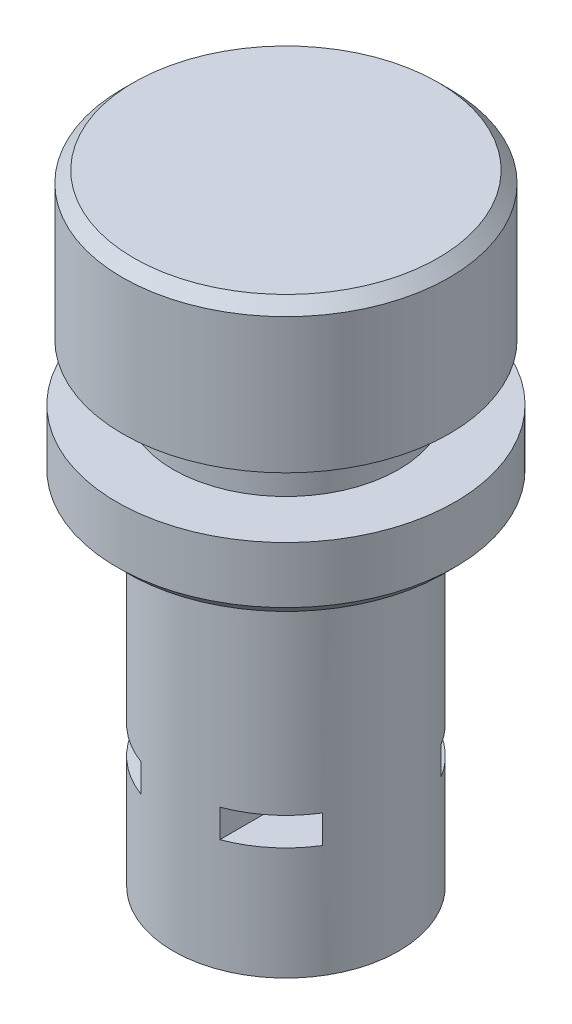
ISO-10303-21;
HEADER;
FILE_DESCRIPTION(('STEP AP214'),'2;1');
FILE_NAME('part.step','',(''),(''),'','','');
FILE_SCHEMA(('AUTOMOTIVE_DESIGN { 1 0 10303 214 1 1 1 1 }'));
ENDSEC;
DATA;
#1=APPLICATION_CONTEXT('core data for automotive mechanical design processes');
#2=APPLICATION_PROTOCOL_DEFINITION('international standard','automotive_design',2000,#1);
#3=PRODUCT_CONTEXT('',#1,'mechanical');
#4=PRODUCT('Part','Part','',(#3));
#5=PRODUCT_RELATED_PRODUCT_CATEGORY('part','',(#4));
#6=PRODUCT_DEFINITION_FORMATION('','',#4);
#7=PRODUCT_DEFINITION_CONTEXT('part definition',#1,'design');
#8=PRODUCT_DEFINITION('design','',#6,#7);
#9=PRODUCT_DEFINITION_SHAPE('','',#8);
#10=(LENGTH_UNIT() NAMED_UNIT(*) SI_UNIT(.MILLI.,.METRE.));
#11=(NAMED_UNIT(*) PLANE_ANGLE_UNIT() SI_UNIT($,.RADIAN.));
#12=(NAMED_UNIT(*) SI_UNIT($,.STERADIAN.) SOLID_ANGLE_UNIT());
#13=UNCERTAINTY_MEASURE_WITH_UNIT(LENGTH_MEASURE(1.E-05),#10,'distance_accuracy_value','');
#14=(GEOMETRIC_REPRESENTATION_CONTEXT(3) GLOBAL_UNCERTAINTY_ASSIGNED_CONTEXT((#13)) GLOBAL_UNIT_ASSIGNED_CONTEXT((#10,
#11,#12)) REPRESENTATION_CONTEXT('',''));
#15=CARTESIAN_POINT('',(0.,0.,0.));
#16=DIRECTION('',(0.,0.,1.));
#17=DIRECTION('',(1.,0.,0.));
#18=AXIS2_PLACEMENT_3D('',#15,#16,#17);
#19=CARTESIAN_POINT('',(0.,-42.,0.));
#20=DIRECTION('',(0.,1.,0.));
#21=DIRECTION('',(0.,0.,1.));
#22=AXIS2_PLACEMENT_3D('',#19,#20,#21);
#23=CYLINDRICAL_SURFACE('',#22,10.);
#24=CARTESIAN_POINT('',(0.,0.,0.));
#25=DIRECTION('',(0.,-1.,0.));
#26=DIRECTION('',(0.,0.,-1.));
#27=AXIS2_PLACEMENT_3D('',#24,#25,#26);
#28=CIRCLE('',#27,10.);
#29=CARTESIAN_POINT('',(0.,0.,10.));
#30=VERTEX_POINT('',#29);
#31=EDGE_CURVE('E242',#30,#30,#28,.T.);
#32=CARTESIAN_POINT('',(0.,-5.,0.));
#33=DIRECTION('',(0.,-1.,0.));
#34=DIRECTION('',(0.,0.,-1.));
#35=AXIS2_PLACEMENT_3D('',#32,#33,#34);
#36=CIRCLE('',#35,10.);
#37=CARTESIAN_POINT('',(0.,-4.99999999999999,10.));
#38=VERTEX_POINT('',#37);
#39=EDGE_CURVE('E176',#38,#38,#36,.T.);
#40=CARTESIAN_POINT('',(0.,0.,10.));
#41=CARTESIAN_POINT('',(0.,-0.0520833333333322,10.));
#42=CARTESIAN_POINT('',(0.,-0.104166666666664,10.));
#43=CARTESIAN_POINT('',(0.,-0.208333333333331,10.));
#44=CARTESIAN_POINT('',(0.,-0.260416666666666,10.));
#45=CARTESIAN_POINT('',(0.,-0.364583333333332,10.));
#46=CARTESIAN_POINT('',(0.,-0.416666666666665,10.));
#47=CARTESIAN_POINT('',(0.,-0.520833333333331,10.));
#48=CARTESIAN_POINT('',(0.,-0.572916666666666,10.));
#49=CARTESIAN_POINT('',(0.,-0.677083333333333,10.));
#50=CARTESIAN_POINT('',(0.,-0.729166666666665,10.));
#51=CARTESIAN_POINT('',(0.,-0.833333333333332,10.));
#52=CARTESIAN_POINT('',(0.,-0.885416666666666,10.));
#53=CARTESIAN_POINT('',(0.,-0.989583333333333,10.));
#54=CARTESIAN_POINT('',(0.,-1.04166666666667,10.));
#55=CARTESIAN_POINT('',(0.,-1.14583333333333,10.));
#56=CARTESIAN_POINT('',(0.,-1.19791666666667,10.));
#57=CARTESIAN_POINT('',(0.,-1.30208333333333,10.));
#58=CARTESIAN_POINT('',(0.,-1.35416666666667,10.));
#59=CARTESIAN_POINT('',(0.,-1.45833333333333,10.));
#60=CARTESIAN_POINT('',(0.,-1.51041666666666,10.));
#61=CARTESIAN_POINT('',(0.,-1.61458333333333,10.));
#62=CARTESIAN_POINT('',(0.,-1.66666666666666,10.));
#63=CARTESIAN_POINT('',(0.,-1.77083333333333,10.));
#64=CARTESIAN_POINT('',(0.,-1.82291666666666,10.));
#65=CARTESIAN_POINT('',(0.,-1.92708333333333,10.));
#66=CARTESIAN_POINT('',(0.,-1.97916666666666,10.));
#67=CARTESIAN_POINT('',(0.,-2.08333333333333,10.));
#68=CARTESIAN_POINT('',(0.,-2.13541666666666,10.));
#69=CARTESIAN_POINT('',(0.,-2.23958333333333,10.));
#70=CARTESIAN_POINT('',(0.,-2.29166666666666,10.));
#71=CARTESIAN_POINT('',(0.,-2.39583333333333,10.));
#72=CARTESIAN_POINT('',(0.,-2.44791666666666,10.));
#73=CARTESIAN_POINT('',(0.,-2.55208333333333,10.));
#74=CARTESIAN_POINT('',(0.,-2.60416666666666,10.));
#75=CARTESIAN_POINT('',(0.,-2.70833333333333,10.));
#76=CARTESIAN_POINT('',(0.,-2.76041666666666,10.));
#77=CARTESIAN_POINT('',(0.,-2.86458333333333,10.));
#78=CARTESIAN_POINT('',(0.,-2.91666666666666,10.));
#79=CARTESIAN_POINT('',(0.,-3.02083333333333,10.));
#80=CARTESIAN_POINT('',(0.,-3.07291666666666,10.));
#81=CARTESIAN_POINT('',(0.,-3.17708333333333,10.));
#82=CARTESIAN_POINT('',(0.,-3.22916666666666,10.));
#83=CARTESIAN_POINT('',(0.,-3.33333333333333,10.));
#84=CARTESIAN_POINT('',(0.,-3.38541666666666,10.));
#85=CARTESIAN_POINT('',(0.,-3.48958333333333,10.));
#86=CARTESIAN_POINT('',(0.,-3.54166666666666,10.));
#87=CARTESIAN_POINT('',(0.,-3.64583333333333,10.));
#88=CARTESIAN_POINT('',(0.,-3.69791666666666,10.));
#89=CARTESIAN_POINT('',(0.,-3.80208333333332,10.));
#90=CARTESIAN_POINT('',(0.,-3.85416666666666,10.));
#91=CARTESIAN_POINT('',(0.,-3.95833333333333,10.));
#92=CARTESIAN_POINT('',(0.,-4.01041666666666,10.));
#93=CARTESIAN_POINT('',(0.,-4.11458333333332,10.));
#94=CARTESIAN_POINT('',(0.,-4.16666666666666,10.));
#95=CARTESIAN_POINT('',(0.,-4.27083333333333,10.));
#96=CARTESIAN_POINT('',(0.,-4.32291666666666,10.));
#97=CARTESIAN_POINT('',(0.,-4.42708333333332,10.));
#98=CARTESIAN_POINT('',(0.,-4.47916666666666,10.));
#99=CARTESIAN_POINT('',(0.,-4.58333333333333,10.));
#100=CARTESIAN_POINT('',(0.,-4.63541666666666,10.));
#101=CARTESIAN_POINT('',(0.,-4.73958333333333,10.));
#102=CARTESIAN_POINT('',(0.,-4.79166666666666,10.));
#103=CARTESIAN_POINT('',(0.,-4.89583333333333,10.));
#104=CARTESIAN_POINT('',(0.,-4.94791666666666,10.));
#105=CARTESIAN_POINT('',(0.,-4.99999999999999,10.));
#106=B_SPLINE_CURVE_WITH_KNOTS('',3,(#40,#41,#42,#43,#44,#45,#46,#47,#48,#49,#50,#51,#52,#53,
#54,#55,#56,#57,#58,#59,#60,#61,#62,#63,#64,#65,#66,#67,#68,#69,#70,#71,#72,#73,#74,#75,#76,#77,
#78,#79,#80,#81,#82,#83,#84,#85,#86,#87,#88,#89,#90,#91,#92,#93,#94,#95,#96,#97,#98,#99,#100,
#101,#102,#103,#104,#105),.UNSPECIFIED.,.F.,.F.,(4,2,2,2,2,2,2,2,2,2,2,2,2,2,2,2,2,2,2,2,2,2,2,
2,2,2,2,2,2,2,2,2,4),(0.,0.156249999999997,0.3125,0.468749999999997,0.625000000000001,
0.781249999999997,0.937500000000001,1.09375,1.25,1.40625,1.56249999999999,1.71875,
1.87499999999999,2.03125,2.1875,2.34375,2.5,2.65624999999999,2.8125,2.96874999999999,3.125,
3.28124999999999,3.4375,3.59374999999999,3.74999999999999,3.90624999999999,4.06249999999999,
4.21874999999999,4.37499999999999,4.53124999999999,4.68749999999999,4.84374999999999,
4.99999999999999),.UNSPECIFIED.);
#107=EDGE_CURVE('BSEAM51',#30,#38,#106,.T.);
#108=ORIENTED_EDGE('',*,*,#31,.T.);
#109=ORIENTED_EDGE('',*,*,#39,.F.);
#110=ORIENTED_EDGE('',*,*,#107,.T.);
#111=ORIENTED_EDGE('',*,*,#107,.F.);
#112=EDGE_LOOP('',(#108,#110,#109,#111));
#113=FACE_BOUND('',#112,.T.);
#114=ADVANCED_FACE('F51',(#113),#23,.T.);
#115=CARTESIAN_POINT('',(0.,13.,0.));
#116=DIRECTION('',(0.,-1.,0.));
#117=DIRECTION('',(0.,0.,-1.));
#118=AXIS2_PLACEMENT_3D('',#115,#116,#117);
#119=CYLINDRICAL_SURFACE('',#118,14.5);
#120=CARTESIAN_POINT('',(0.,12.,0.));
#121=DIRECTION('',(0.,1.,0.));
#122=DIRECTION('',(0.,0.,1.));
#123=AXIS2_PLACEMENT_3D('',#120,#121,#122);
#124=CIRCLE('',#123,14.5);
#125=CARTESIAN_POINT('',(0.,12.,-14.5));
#126=VERTEX_POINT('',#125);
#127=EDGE_CURVE('E236',#126,#126,#124,.F.);
#128=CARTESIAN_POINT('',(0.,0.,0.));
#129=DIRECTION('',(0.,1.,0.));
#130=DIRECTION('',(0.,0.,1.));
#131=AXIS2_PLACEMENT_3D('',#128,#129,#130);
#132=CIRCLE('',#131,14.5);
#133=CARTESIAN_POINT('',(0.,0.,-14.5));
#134=VERTEX_POINT('',#133);
#135=EDGE_CURVE('E240',#134,#134,#132,.T.);
#136=CARTESIAN_POINT('',(0.,12.,-14.5));
#137=CARTESIAN_POINT('',(0.,11.875,-14.5));
#138=CARTESIAN_POINT('',(0.,11.75,-14.5));
#139=CARTESIAN_POINT('',(0.,11.5,-14.5));
#140=CARTESIAN_POINT('',(0.,11.375,-14.5));
#141=CARTESIAN_POINT('',(0.,11.125,-14.5));
#142=CARTESIAN_POINT('',(0.,11.,-14.5));
#143=CARTESIAN_POINT('',(0.,10.75,-14.5));
#144=CARTESIAN_POINT('',(0.,10.625,-14.5));
#145=CARTESIAN_POINT('',(0.,10.375,-14.5));
#146=CARTESIAN_POINT('',(0.,10.25,-14.5));
#147=CARTESIAN_POINT('',(0.,10.,-14.5));
#148=CARTESIAN_POINT('',(0.,9.87500000000001,-14.5));
#149=CARTESIAN_POINT('',(0.,9.62500000000001,-14.5));
#150=CARTESIAN_POINT('',(0.,9.50000000000001,-14.5));
#151=CARTESIAN_POINT('',(0.,9.25000000000001,-14.5));
#152=CARTESIAN_POINT('',(0.,9.12500000000001,-14.5));
#153=CARTESIAN_POINT('',(0.,8.87500000000001,-14.5));
#154=CARTESIAN_POINT('',(0.,8.75000000000001,-14.5));
#155=CARTESIAN_POINT('',(0.,8.50000000000001,-14.5));
#156=CARTESIAN_POINT('',(0.,8.37500000000001,-14.5));
#157=CARTESIAN_POINT('',(0.,8.12500000000001,-14.5));
#158=CARTESIAN_POINT('',(0.,8.00000000000001,-14.5));
#159=CARTESIAN_POINT('',(0.,7.75000000000001,-14.5));
#160=CARTESIAN_POINT('',(0.,7.62500000000001,-14.5));
#161=CARTESIAN_POINT('',(0.,7.37500000000001,-14.5));
#162=CARTESIAN_POINT('',(0.,7.25000000000001,-14.5));
#163=CARTESIAN_POINT('',(0.,7.00000000000001,-14.5));
#164=CARTESIAN_POINT('',(0.,6.87500000000001,-14.5));
#165=CARTESIAN_POINT('',(0.,6.62500000000001,-14.5));
#166=CARTESIAN_POINT('',(0.,6.50000000000001,-14.5));
#167=CARTESIAN_POINT('',(0.,6.25000000000001,-14.5));
#168=CARTESIAN_POINT('',(0.,6.12500000000001,-14.5));
#169=CARTESIAN_POINT('',(0.,5.87500000000001,-14.5));
#170=CARTESIAN_POINT('',(0.,5.75000000000001,-14.5));
#171=CARTESIAN_POINT('',(0.,5.50000000000001,-14.5));
#172=CARTESIAN_POINT('',(0.,5.37500000000001,-14.5));
#173=CARTESIAN_POINT('',(0.,5.12500000000001,-14.5));
#174=CARTESIAN_POINT('',(0.,5.00000000000001,-14.5));
#175=CARTESIAN_POINT('',(0.,4.75000000000001,-14.5));
#176=CARTESIAN_POINT('',(0.,4.62500000000001,-14.5));
#177=CARTESIAN_POINT('',(0.,4.37500000000001,-14.5));
#178=CARTESIAN_POINT('',(0.,4.25000000000001,-14.5));
#179=CARTESIAN_POINT('',(0.,4.00000000000001,-14.5));
#180=CARTESIAN_POINT('',(0.,3.87500000000001,-14.5));
#181=CARTESIAN_POINT('',(0.,3.625,-14.5));
#182=CARTESIAN_POINT('',(0.,3.5,-14.5));
#183=CARTESIAN_POINT('',(0.,3.25,-14.5));
#184=CARTESIAN_POINT('',(0.,3.125,-14.5));
#185=CARTESIAN_POINT('',(0.,2.875,-14.5));
#186=CARTESIAN_POINT('',(0.,2.75,-14.5));
#187=CARTESIAN_POINT('',(0.,2.5,-14.5));
#188=CARTESIAN_POINT('',(0.,2.375,-14.5));
#189=CARTESIAN_POINT('',(0.,2.125,-14.5));
#190=CARTESIAN_POINT('',(0.,2.,-14.5));
#191=CARTESIAN_POINT('',(0.,1.75,-14.5));
#192=CARTESIAN_POINT('',(0.,1.625,-14.5));
#193=CARTESIAN_POINT('',(0.,1.375,-14.5));
#194=CARTESIAN_POINT('',(0.,1.25,-14.5));
#195=CARTESIAN_POINT('',(0.,1.,-14.5));
#196=CARTESIAN_POINT('',(0.,0.875000000000001,-14.5));
#197=CARTESIAN_POINT('',(0.,0.625000000000001,-14.5));
#198=CARTESIAN_POINT('',(0.,0.5,-14.5));
#199=CARTESIAN_POINT('',(0.,0.25,-14.5));
#200=CARTESIAN_POINT('',(0.,0.125,-14.5));
#201=CARTESIAN_POINT('',(0.,0.,-14.5));
#202=B_SPLINE_CURVE_WITH_KNOTS('',3,(#136,#137,#138,#139,#140,#141,#142,#143,#144,#145,#146,
#147,#148,#149,#150,#151,#152,#153,#154,#155,#156,#157,#158,#159,#160,#161,#162,#163,#164,#165,
#166,#167,#168,#169,#170,#171,#172,#173,#174,#175,#176,#177,#178,#179,#180,#181,#182,#183,#184,
#185,#186,#187,#188,#189,#190,#191,#192,#193,#194,#195,#196,#197,#198,#199,#200,#201),
.UNSPECIFIED.,.F.,.F.,(4,2,2,2,2,2,2,2,2,2,2,2,2,2,2,2,2,2,2,2,2,2,2,2,2,2,2,2,2,2,2,2,4),(0.,
0.375,0.750000000000001,1.125,1.5,1.875,2.25,2.625,3.,3.375,3.75,4.12500000000001,4.5,
4.87500000000001,5.25000000000001,5.62500000000001,6.00000000000001,6.37500000000001,
6.75000000000001,7.12500000000001,7.50000000000001,7.87500000000001,8.25000000000001,
8.62500000000001,9.00000000000001,9.37500000000001,9.75000000000001,10.125,10.5,10.875,11.25,
11.625,12.),.UNSPECIFIED.);
#203=EDGE_CURVE('BSEAM200',#126,#134,#202,.T.);
#204=ORIENTED_EDGE('',*,*,#127,.T.);
#205=ORIENTED_EDGE('',*,*,#135,.T.);
#206=ORIENTED_EDGE('',*,*,#203,.T.);
#207=ORIENTED_EDGE('',*,*,#203,.F.);
#208=EDGE_LOOP('',(#204,#206,#205,#207));
#209=FACE_BOUND('',#208,.T.);
#210=ADVANCED_FACE('F200',(#209),#119,.T.);
#211=CARTESIAN_POINT('',(0.,13.,0.));
#212=DIRECTION('',(0.,1.,0.));
#213=DIRECTION('',(0.,0.,1.));
#214=AXIS2_PLACEMENT_3D('',#211,#212,#213);
#215=PLANE('',#214);
#216=CARTESIAN_POINT('',(0.,13.,0.));
#217=DIRECTION('',(0.,1.,0.));
#218=DIRECTION('',(0.,0.,1.));
#219=AXIS2_PLACEMENT_3D('',#216,#217,#218);
#220=CIRCLE('',#219,13.5);
#221=CARTESIAN_POINT('',(0.,13.,13.5));
#222=VERTEX_POINT('',#221);
#223=EDGE_CURVE('E239',#222,#222,#220,.T.);
#224=ORIENTED_EDGE('',*,*,#223,.T.);
#225=EDGE_LOOP('',(#224));
#226=FACE_BOUND('',#225,.T.);
#227=ADVANCED_FACE('F206',(#226),#215,.T.);
#228=CARTESIAN_POINT('',(0.,0.,0.));
#229=DIRECTION('',(0.,1.,0.));
#230=DIRECTION('',(0.,0.,1.));
#231=AXIS2_PLACEMENT_3D('',#228,#229,#230);
#232=PLANE('',#231);
#233=ORIENTED_EDGE('',*,*,#31,.F.);
#234=EDGE_LOOP('',(#233));
#235=FACE_BOUND('',#234,.T.);
#236=ORIENTED_EDGE('',*,*,#135,.F.);
#237=EDGE_LOOP('',(#236));
#238=FACE_BOUND('',#237,.T.);
#239=ADVANCED_FACE('F216',(#235,#238),#232,.F.);
#240=CARTESIAN_POINT('',(0.,13.,0.));
#241=DIRECTION('',(0.,-1.,0.));
#242=DIRECTION('',(0.,0.,-1.));
#243=AXIS2_PLACEMENT_3D('',#240,#241,#242);
#244=CONICAL_SURFACE('',#243,13.5,0.785398163397447);
#245=ORIENTED_EDGE('',*,*,#127,.F.);
#246=EDGE_LOOP('',(#245));
#247=FACE_BOUND('',#246,.T.);
#248=ORIENTED_EDGE('',*,*,#223,.F.);
#249=EDGE_LOOP('',(#248));
#250=FACE_BOUND('',#249,.T.);
#251=ADVANCED_FACE('F219',(#247,#250),#244,.T.);
#252=CARTESIAN_POINT('',(0.,-11.,0.));
#253=DIRECTION('',(0.,1.,0.));
#254=DIRECTION('',(0.,0.,1.));
#255=AXIS2_PLACEMENT_3D('',#252,#253,#254);
#256=CYLINDRICAL_SURFACE('',#255,15.);
#257=CARTESIAN_POINT('',(0.,-10.,0.));
#258=DIRECTION('',(0.,-1.,0.));
#259=DIRECTION('',(0.,0.,-1.));
#260=AXIS2_PLACEMENT_3D('',#257,#258,#259);
#261=CIRCLE('',#260,15.);
#262=CARTESIAN_POINT('',(0.,-10.,-15.));
#263=VERTEX_POINT('',#262);
#264=EDGE_CURVE('E11',#263,#263,#261,.F.);
#265=ORIENTED_EDGE('',*,*,#264,.T.);
#266=EDGE_LOOP('',(#265));
#267=FACE_BOUND('',#266,.T.);
#268=CARTESIAN_POINT('',(0.,-5.,0.));
#269=DIRECTION('',(0.,-1.,0.));
#270=DIRECTION('',(0.,0.,-1.));
#271=AXIS2_PLACEMENT_3D('',#268,#269,#270);
#272=CIRCLE('',#271,15.);
#273=CARTESIAN_POINT('',(0.,-5.,-15.));
#274=VERTEX_POINT('',#273);
#275=EDGE_CURVE('E182',#274,#274,#272,.T.);
#276=ORIENTED_EDGE('',*,*,#275,.T.);
#277=EDGE_LOOP('',(#276));
#278=FACE_BOUND('',#277,.T.);
#279=ADVANCED_FACE('F225',(#267,#278),#256,.T.);
#280=CARTESIAN_POINT('',(0.,-11.,0.));
#281=DIRECTION('',(0.,-1.,0.));
#282=DIRECTION('',(0.,0.,-1.));
#283=AXIS2_PLACEMENT_3D('',#280,#281,#282);
#284=PLANE('',#283);
#285=CARTESIAN_POINT('',(0.,-11.,0.));
#286=DIRECTION('',(0.,-1.,0.));
#287=DIRECTION('',(0.,0.,-1.));
#288=AXIS2_PLACEMENT_3D('',#285,#286,#287);
#289=CIRCLE('',#288,14.);
#290=CARTESIAN_POINT('',(0.,-11.,-14.));
#291=VERTEX_POINT('',#290);
#292=EDGE_CURVE('E60',#291,#291,#289,.T.);
#293=ORIENTED_EDGE('',*,*,#292,.T.);
#294=EDGE_LOOP('',(#293));
#295=FACE_BOUND('',#294,.T.);
#296=CARTESIAN_POINT('',(0.,-11.,0.));
#297=DIRECTION('',(0.,-1.,0.));
#298=DIRECTION('',(0.,0.,-1.));
#299=AXIS2_PLACEMENT_3D('',#296,#297,#298);
#300=CIRCLE('',#299,10.);
#301=CARTESIAN_POINT('',(0.,-11.,-10.));
#302=VERTEX_POINT('',#301);
#303=EDGE_CURVE('E179',#302,#302,#300,.T.);
#304=ORIENTED_EDGE('',*,*,#303,.F.);
#305=EDGE_LOOP('',(#304));
#306=FACE_BOUND('',#305,.T.);
#307=ADVANCED_FACE('F186',(#295,#306),#284,.T.);
#308=CARTESIAN_POINT('',(0.,-5.,0.));
#309=DIRECTION('',(0.,-1.,0.));
#310=DIRECTION('',(0.,0.,-1.));
#311=AXIS2_PLACEMENT_3D('',#308,#309,#310);
#312=PLANE('',#311);
#313=ORIENTED_EDGE('',*,*,#39,.T.);
#314=EDGE_LOOP('',(#313));
#315=FACE_BOUND('',#314,.T.);
#316=ORIENTED_EDGE('',*,*,#275,.F.);
#317=EDGE_LOOP('',(#316));
#318=FACE_BOUND('',#317,.T.);
#319=ADVANCED_FACE('F323',(#315,#318),#312,.F.);
#320=CARTESIAN_POINT('',(6.,13.002,0.));
#321=DIRECTION('',(0.,-1.,0.));
#322=DIRECTION('',(0.,0.,-1.));
#323=AXIS2_PLACEMENT_3D('',#320,#321,#322);
#324=CYLINDRICAL_SURFACE('',#323,1.);
#325=CARTESIAN_POINT('',(6.,-32.,0.));
#326=DIRECTION('',(0.,-1.,0.));
#327=DIRECTION('',(0.,0.,-1.));
#328=AXIS2_PLACEMENT_3D('',#325,#326,#327);
#329=CIRCLE('',#328,1.);
#330=CARTESIAN_POINT('',(6.,-32.,-1.));
#331=VERTEX_POINT('',#330);
#332=EDGE_CURVE('E173',#331,#331,#329,.F.);
#333=ORIENTED_EDGE('',*,*,#332,.T.);
#334=EDGE_LOOP('',(#333));
#335=FACE_BOUND('',#334,.T.);
#336=CARTESIAN_POINT('',(6.,-29.5,0.));
#337=DIRECTION('',(0.,1.,0.));
#338=DIRECTION('',(0.,0.,1.));
#339=AXIS2_PLACEMENT_3D('',#336,#337,#338);
#340=CIRCLE('',#339,1.);
#341=CARTESIAN_POINT('',(6.,-29.5,1.));
#342=VERTEX_POINT('',#341);
#343=EDGE_CURVE('E170',#342,#342,#340,.F.);
#344=ORIENTED_EDGE('',*,*,#343,.T.);
#345=EDGE_LOOP('',(#344));
#346=FACE_BOUND('',#345,.T.);
#347=ADVANCED_FACE('F319',(#335,#346),#324,.T.);
#348=CARTESIAN_POINT('',(-6.,13.002,0.));
#349=DIRECTION('',(0.,-1.,0.));
#350=DIRECTION('',(0.,0.,-1.));
#351=AXIS2_PLACEMENT_3D('',#348,#349,#350);
#352=CYLINDRICAL_SURFACE('',#351,1.);
#353=CARTESIAN_POINT('',(-6.,-32.,0.));
#354=DIRECTION('',(0.,-1.,0.));
#355=DIRECTION('',(0.,0.,1.));
#356=AXIS2_PLACEMENT_3D('',#353,#354,#355);
#357=CIRCLE('',#356,1.);
#358=CARTESIAN_POINT('',(-6.,-32.,1.));
#359=VERTEX_POINT('',#358);
#360=EDGE_CURVE('E259',#359,#359,#357,.T.);
#361=ORIENTED_EDGE('',*,*,#360,.F.);
#362=EDGE_LOOP('',(#361));
#363=FACE_BOUND('',#362,.T.);
#364=CARTESIAN_POINT('',(-6.,-29.5,0.));
#365=DIRECTION('',(0.,1.,0.));
#366=DIRECTION('',(0.,0.,1.));
#367=AXIS2_PLACEMENT_3D('',#364,#365,#366);
#368=CIRCLE('',#367,1.);
#369=CARTESIAN_POINT('',(-6.,-29.5,1.));
#370=VERTEX_POINT('',#369);
#371=EDGE_CURVE('E181',#370,#370,#368,.F.);
#372=ORIENTED_EDGE('',*,*,#371,.T.);
#373=EDGE_LOOP('',(#372));
#374=FACE_BOUND('',#373,.T.);
#375=ADVANCED_FACE('F322',(#363,#374),#352,.T.);
#376=CARTESIAN_POINT('',(0.,-42.,0.));
#377=DIRECTION('',(0.,-1.,0.));
#378=DIRECTION('',(0.,0.,-1.));
#379=AXIS2_PLACEMENT_3D('',#376,#377,#378);
#380=PLANE('',#379);
#381=CARTESIAN_POINT('',(0.,-42.,0.));
#382=DIRECTION('',(0.,-1.,0.));
#383=DIRECTION('',(0.,0.,-1.));
#384=AXIS2_PLACEMENT_3D('',#381,#382,#383);
#385=CIRCLE('',#384,10.);
#386=CARTESIAN_POINT('',(0.,-42.,-10.));
#387=VERTEX_POINT('',#386);
#388=EDGE_CURVE('E245',#387,#387,#385,.T.);
#389=ORIENTED_EDGE('',*,*,#388,.T.);
#390=EDGE_LOOP('',(#389));
#391=FACE_BOUND('',#390,.T.);
#392=ADVANCED_FACE('F213',(#391),#380,.T.);
#393=CARTESIAN_POINT('',(3.5,-29.5,-14.5));
#394=DIRECTION('',(-1.,0.,0.));
#395=DIRECTION('',(0.,0.,1.));
#396=AXIS2_PLACEMENT_3D('',#393,#394,#395);
#397=PLANE('',#396);
#398=DIRECTION('',(0.,0.,1.));
#399=VECTOR('',#398,1.);
#400=CARTESIAN_POINT('',(3.5,-32.,-14.5));
#401=LINE('',#400,#399);
#402=CARTESIAN_POINT('',(3.5,-32.,-9.3674969975976));
#403=VERTEX_POINT('',#402);
#404=CARTESIAN_POINT('',(3.5,-32.,9.3674969975976));
#405=VERTEX_POINT('',#404);
#406=EDGE_CURVE('E137',#403,#405,#401,.T.);
#407=ORIENTED_EDGE('',*,*,#406,.F.);
#408=DIRECTION('',(0.,1.,0.));
#409=VECTOR('',#408,1.);
#410=CARTESIAN_POINT('',(3.5,-42.,-9.3674969975976));
#411=LINE('',#410,#409);
#412=CARTESIAN_POINT('',(3.5,-29.5,-9.3674969975976));
#413=VERTEX_POINT('',#412);
#414=EDGE_CURVE('E135',#413,#403,#411,.F.);
#415=ORIENTED_EDGE('',*,*,#414,.F.);
#416=DIRECTION('',(0.,0.,1.));
#417=VECTOR('',#416,1.);
#418=CARTESIAN_POINT('',(3.5,-29.5,-14.5));
#419=LINE('',#418,#417);
#420=CARTESIAN_POINT('',(3.5,-29.5,9.3674969975976));
#421=VERTEX_POINT('',#420);
#422=EDGE_CURVE('E118',#413,#421,#419,.T.);
#423=ORIENTED_EDGE('',*,*,#422,.T.);
#424=DIRECTION('',(0.,1.,0.));
#425=VECTOR('',#424,1.);
#426=CARTESIAN_POINT('',(3.5,-42.,9.3674969975976));
#427=LINE('',#426,#425);
#428=EDGE_CURVE('E126',#405,#421,#427,.T.);
#429=ORIENTED_EDGE('',*,*,#428,.F.);
#430=EDGE_LOOP('',(#407,#415,#423,#429));
#431=FACE_BOUND('',#430,.T.);
#432=ADVANCED_FACE('F132',(#431),#397,.F.);
#433=CARTESIAN_POINT('',(8.5,-32.,-14.5));
#434=DIRECTION('',(0.,-1.,0.));
#435=DIRECTION('',(0.,0.,-1.));
#436=AXIS2_PLACEMENT_3D('',#433,#434,#435);
#437=PLANE('',#436);
#438=ORIENTED_EDGE('',*,*,#332,.F.);
#439=EDGE_LOOP('',(#438));
#440=FACE_BOUND('',#439,.T.);
#441=ORIENTED_EDGE('',*,*,#406,.T.);
#442=CARTESIAN_POINT('',(0.,-32.,0.));
#443=DIRECTION('',(0.,-1.,0.));
#444=DIRECTION('',(0.,0.,-1.));
#445=AXIS2_PLACEMENT_3D('',#442,#443,#444);
#446=CIRCLE('',#445,10.);
#447=CARTESIAN_POINT('',(8.5,-32.,5.26782687642637));
#448=VERTEX_POINT('',#447);
#449=EDGE_CURVE('E142',#448,#405,#446,.T.);
#450=ORIENTED_EDGE('',*,*,#449,.F.);
#451=DIRECTION('',(0.,0.,1.));
#452=VECTOR('',#451,1.);
#453=CARTESIAN_POINT('',(8.5,-32.,-14.5));
#454=LINE('',#453,#452);
#455=CARTESIAN_POINT('',(8.5,-32.,-5.26782687642637));
#456=VERTEX_POINT('',#455);
#457=EDGE_CURVE('E256',#456,#448,#454,.T.);
#458=ORIENTED_EDGE('',*,*,#457,.F.);
#459=EDGE_CURVE('E146',#403,#456,#446,.T.);
#460=ORIENTED_EDGE('',*,*,#459,.F.);
#461=EDGE_LOOP('',(#441,#450,#458,#460));
#462=FACE_BOUND('',#461,.T.);
#463=ADVANCED_FACE('F258',(#440,#462),#437,.F.);
#464=CARTESIAN_POINT('',(8.5,-29.5,-14.5));
#465=DIRECTION('',(1.,0.,0.));
#466=DIRECTION('',(0.,0.,-1.));
#467=AXIS2_PLACEMENT_3D('',#464,#465,#466);
#468=PLANE('',#467);
#469=ORIENTED_EDGE('',*,*,#457,.T.);
#470=DIRECTION('',(0.,1.,0.));
#471=VECTOR('',#470,1.);
#472=CARTESIAN_POINT('',(8.5,-42.,5.26782687642637));
#473=LINE('',#472,#471);
#474=CARTESIAN_POINT('',(8.5,-29.5,5.26782687642637));
#475=VERTEX_POINT('',#474);
#476=EDGE_CURVE('E144',#475,#448,#473,.F.);
#477=ORIENTED_EDGE('',*,*,#476,.F.);
#478=DIRECTION('',(0.,0.,1.));
#479=VECTOR('',#478,1.);
#480=CARTESIAN_POINT('',(8.5,-29.5,-14.5));
#481=LINE('',#480,#479);
#482=CARTESIAN_POINT('',(8.5,-29.5,-5.26782687642637));
#483=VERTEX_POINT('',#482);
#484=EDGE_CURVE('E121',#483,#475,#481,.T.);
#485=ORIENTED_EDGE('',*,*,#484,.F.);
#486=DIRECTION('',(0.,1.,0.));
#487=VECTOR('',#486,1.);
#488=CARTESIAN_POINT('',(8.5,-42.,-5.26782687642637));
#489=LINE('',#488,#487);
#490=EDGE_CURVE('E127',#456,#483,#489,.T.);
#491=ORIENTED_EDGE('',*,*,#490,.F.);
#492=EDGE_LOOP('',(#469,#477,#485,#491));
#493=FACE_BOUND('',#492,.T.);
#494=ADVANCED_FACE('F255',(#493),#468,.F.);
#495=CARTESIAN_POINT('',(8.5,-29.5,-14.5));
#496=DIRECTION('',(0.,1.,0.));
#497=DIRECTION('',(0.,0.,1.));
#498=AXIS2_PLACEMENT_3D('',#495,#496,#497);
#499=PLANE('',#498);
#500=ORIENTED_EDGE('',*,*,#343,.F.);
#501=EDGE_LOOP('',(#500));
#502=FACE_BOUND('',#501,.T.);
#503=ORIENTED_EDGE('',*,*,#422,.F.);
#504=CARTESIAN_POINT('',(0.,-29.5,0.));
#505=DIRECTION('',(0.,1.,0.));
#506=DIRECTION('',(0.,0.,1.));
#507=AXIS2_PLACEMENT_3D('',#504,#505,#506);
#508=CIRCLE('',#507,10.);
#509=EDGE_CURVE('E129',#483,#413,#508,.T.);
#510=ORIENTED_EDGE('',*,*,#509,.F.);
#511=ORIENTED_EDGE('',*,*,#484,.T.);
#512=EDGE_CURVE('E115',#421,#475,#508,.T.);
#513=ORIENTED_EDGE('',*,*,#512,.F.);
#514=EDGE_LOOP('',(#503,#510,#511,#513));
#515=FACE_BOUND('',#514,.T.);
#516=ADVANCED_FACE('F117',(#502,#515),#499,.F.);
#517=CARTESIAN_POINT('',(-8.5,-29.5,-14.5));
#518=DIRECTION('',(-1.,0.,0.));
#519=DIRECTION('',(0.,0.,1.));
#520=AXIS2_PLACEMENT_3D('',#517,#518,#519);
#521=PLANE('',#520);
#522=DIRECTION('',(0.,0.,1.));
#523=VECTOR('',#522,1.);
#524=CARTESIAN_POINT('',(-8.5,-32.,-14.5));
#525=LINE('',#524,#523);
#526=CARTESIAN_POINT('',(-8.5,-32.,-5.26782687642637));
#527=VERTEX_POINT('',#526);
#528=CARTESIAN_POINT('',(-8.5,-32.,5.26782687642637));
#529=VERTEX_POINT('',#528);
#530=EDGE_CURVE('E274',#527,#529,#525,.T.);
#531=ORIENTED_EDGE('',*,*,#530,.F.);
#532=DIRECTION('',(0.,1.,0.));
#533=VECTOR('',#532,1.);
#534=CARTESIAN_POINT('',(-8.5,-42.,-5.26782687642637));
#535=LINE('',#534,#533);
#536=CARTESIAN_POINT('',(-8.5,-29.5,-5.26782687642637));
#537=VERTEX_POINT('',#536);
#538=EDGE_CURVE('E164',#537,#527,#535,.F.);
#539=ORIENTED_EDGE('',*,*,#538,.F.);
#540=DIRECTION('',(0.,0.,1.));
#541=VECTOR('',#540,1.);
#542=CARTESIAN_POINT('',(-8.5,-29.5,-14.5));
#543=LINE('',#542,#541);
#544=CARTESIAN_POINT('',(-8.5,-29.5,5.26782687642637));
#545=VERTEX_POINT('',#544);
#546=EDGE_CURVE('E67',#537,#545,#543,.T.);
#547=ORIENTED_EDGE('',*,*,#546,.T.);
#548=DIRECTION('',(0.,1.,0.));
#549=VECTOR('',#548,1.);
#550=CARTESIAN_POINT('',(-8.5,-42.,5.26782687642637));
#551=LINE('',#550,#549);
#552=EDGE_CURVE('E153',#529,#545,#551,.T.);
#553=ORIENTED_EDGE('',*,*,#552,.F.);
#554=EDGE_LOOP('',(#531,#539,#547,#553));
#555=FACE_BOUND('',#554,.T.);
#556=ADVANCED_FACE('F286',(#555),#521,.F.);
#557=CARTESIAN_POINT('',(-8.5,-29.5,-14.5));
#558=DIRECTION('',(0.,1.,0.));
#559=DIRECTION('',(0.,0.,1.));
#560=AXIS2_PLACEMENT_3D('',#557,#558,#559);
#561=PLANE('',#560);
#562=ORIENTED_EDGE('',*,*,#371,.F.);
#563=EDGE_LOOP('',(#562));
#564=FACE_BOUND('',#563,.T.);
#565=DIRECTION('',(0.,0.,1.));
#566=VECTOR('',#565,1.);
#567=CARTESIAN_POINT('',(-3.5,-29.5,-14.5));
#568=LINE('',#567,#566);
#569=CARTESIAN_POINT('',(-3.5,-29.5,-9.3674969975976));
#570=VERTEX_POINT('',#569);
#571=CARTESIAN_POINT('',(-3.5,-29.5,9.3674969975976));
#572=VERTEX_POINT('',#571);
#573=EDGE_CURVE('E72',#570,#572,#568,.T.);
#574=ORIENTED_EDGE('',*,*,#573,.T.);
#575=CARTESIAN_POINT('',(0.,-29.5,0.));
#576=DIRECTION('',(0.,1.,0.));
#577=DIRECTION('',(0.,0.,1.));
#578=AXIS2_PLACEMENT_3D('',#575,#576,#577);
#579=CIRCLE('',#578,10.);
#580=EDGE_CURVE('E150',#545,#572,#579,.T.);
#581=ORIENTED_EDGE('',*,*,#580,.F.);
#582=ORIENTED_EDGE('',*,*,#546,.F.);
#583=EDGE_CURVE('E154',#570,#537,#579,.T.);
#584=ORIENTED_EDGE('',*,*,#583,.F.);
#585=EDGE_LOOP('',(#574,#581,#582,#584));
#586=FACE_BOUND('',#585,.T.);
#587=ADVANCED_FACE('F292',(#564,#586),#561,.F.);
#588=CARTESIAN_POINT('',(-3.5,-29.5,-14.5));
#589=DIRECTION('',(1.,0.,0.));
#590=DIRECTION('',(0.,0.,-1.));
#591=AXIS2_PLACEMENT_3D('',#588,#589,#590);
#592=PLANE('',#591);
#593=DIRECTION('',(0.,0.,1.));
#594=VECTOR('',#593,1.);
#595=CARTESIAN_POINT('',(-3.5,-32.,-14.5));
#596=LINE('',#595,#594);
#597=CARTESIAN_POINT('',(-3.5,-32.,-9.3674969975976));
#598=VERTEX_POINT('',#597);
#599=CARTESIAN_POINT('',(-3.5,-32.,9.3674969975976));
#600=VERTEX_POINT('',#599);
#601=EDGE_CURVE('E266',#598,#600,#596,.T.);
#602=ORIENTED_EDGE('',*,*,#601,.T.);
#603=DIRECTION('',(0.,1.,0.));
#604=VECTOR('',#603,1.);
#605=CARTESIAN_POINT('',(-3.5,-42.,9.3674969975976));
#606=LINE('',#605,#604);
#607=EDGE_CURVE('E160',#572,#600,#606,.F.);
#608=ORIENTED_EDGE('',*,*,#607,.F.);
#609=ORIENTED_EDGE('',*,*,#573,.F.);
#610=DIRECTION('',(0.,1.,0.));
#611=VECTOR('',#610,1.);
#612=CARTESIAN_POINT('',(-3.5,-42.,-9.3674969975976));
#613=LINE('',#612,#611);
#614=EDGE_CURVE('E167',#598,#570,#613,.T.);
#615=ORIENTED_EDGE('',*,*,#614,.F.);
#616=EDGE_LOOP('',(#602,#608,#609,#615));
#617=FACE_BOUND('',#616,.T.);
#618=ADVANCED_FACE('F293',(#617),#592,.F.);
#619=CARTESIAN_POINT('',(-8.5,-32.,-14.5));
#620=DIRECTION('',(0.,-1.,0.));
#621=DIRECTION('',(0.,0.,-1.));
#622=AXIS2_PLACEMENT_3D('',#619,#620,#621);
#623=PLANE('',#622);
#624=ORIENTED_EDGE('',*,*,#360,.T.);
#625=EDGE_LOOP('',(#624));
#626=FACE_BOUND('',#625,.T.);
#627=ORIENTED_EDGE('',*,*,#601,.F.);
#628=CARTESIAN_POINT('',(0.,-32.,0.));
#629=DIRECTION('',(0.,-1.,0.));
#630=DIRECTION('',(0.,0.,-1.));
#631=AXIS2_PLACEMENT_3D('',#628,#629,#630);
#632=CIRCLE('',#631,10.);
#633=EDGE_CURVE('E161',#527,#598,#632,.T.);
#634=ORIENTED_EDGE('',*,*,#633,.F.);
#635=ORIENTED_EDGE('',*,*,#530,.T.);
#636=EDGE_CURVE('E157',#600,#529,#632,.T.);
#637=ORIENTED_EDGE('',*,*,#636,.F.);
#638=EDGE_LOOP('',(#627,#634,#635,#637));
#639=FACE_BOUND('',#638,.T.);
#640=ADVANCED_FACE('F195',(#626,#639),#623,.F.);
#641=ORIENTED_EDGE('',*,*,#303,.T.);
#642=EDGE_LOOP('',(#641));
#643=FACE_BOUND('',#642,.T.);
#644=ORIENTED_EDGE('',*,*,#633,.T.);
#645=ORIENTED_EDGE('',*,*,#614,.T.);
#646=ORIENTED_EDGE('',*,*,#583,.T.);
#647=ORIENTED_EDGE('',*,*,#538,.T.);
#648=EDGE_LOOP('',(#644,#645,#646,#647));
#649=FACE_BOUND('',#648,.T.);
#650=ORIENTED_EDGE('',*,*,#580,.T.);
#651=ORIENTED_EDGE('',*,*,#607,.T.);
#652=ORIENTED_EDGE('',*,*,#636,.T.);
#653=ORIENTED_EDGE('',*,*,#552,.T.);
#654=EDGE_LOOP('',(#650,#651,#652,#653));
#655=FACE_BOUND('',#654,.T.);
#656=ORIENTED_EDGE('',*,*,#512,.T.);
#657=ORIENTED_EDGE('',*,*,#476,.T.);
#658=ORIENTED_EDGE('',*,*,#449,.T.);
#659=ORIENTED_EDGE('',*,*,#428,.T.);
#660=EDGE_LOOP('',(#656,#657,#658,#659));
#661=FACE_BOUND('',#660,.T.);
#662=ORIENTED_EDGE('',*,*,#459,.T.);
#663=ORIENTED_EDGE('',*,*,#490,.T.);
#664=ORIENTED_EDGE('',*,*,#509,.T.);
#665=ORIENTED_EDGE('',*,*,#414,.T.);
#666=EDGE_LOOP('',(#662,#663,#664,#665));
#667=FACE_BOUND('',#666,.T.);
#668=ORIENTED_EDGE('',*,*,#388,.F.);
#669=EDGE_LOOP('',(#668));
#670=FACE_BOUND('',#669,.T.);
#671=ADVANCED_FACE('F140',(#643,#649,#655,#661,#667,#670),#23,.T.);
#672=CARTESIAN_POINT('',(0.,-11.,0.));
#673=DIRECTION('',(0.,1.,0.));
#674=DIRECTION('',(0.,0.,1.));
#675=AXIS2_PLACEMENT_3D('',#672,#673,#674);
#676=CONICAL_SURFACE('',#675,14.,0.785398163397447);
#677=ORIENTED_EDGE('',*,*,#264,.F.);
#678=EDGE_LOOP('',(#677));
#679=FACE_BOUND('',#678,.T.);
#680=ORIENTED_EDGE('',*,*,#292,.F.);
#681=EDGE_LOOP('',(#680));
#682=FACE_BOUND('',#681,.T.);
#683=ADVANCED_FACE('F54',(#679,#682),#676,.T.);
#684=CLOSED_SHELL('',(#114,#210,#227,#239,#251,#279,#307,#319,#347,#375,#392,#432,#463,#494,
#516,#556,#587,#618,#640,#671,#683));
#685=MANIFOLD_SOLID_BREP('B2',#684);
#686=ADVANCED_BREP_SHAPE_REPRESENTATION('',(#18,#685),#14);
#687=SHAPE_DEFINITION_REPRESENTATION(#9,#686);
ENDSEC;
END-ISO-10303-21;
